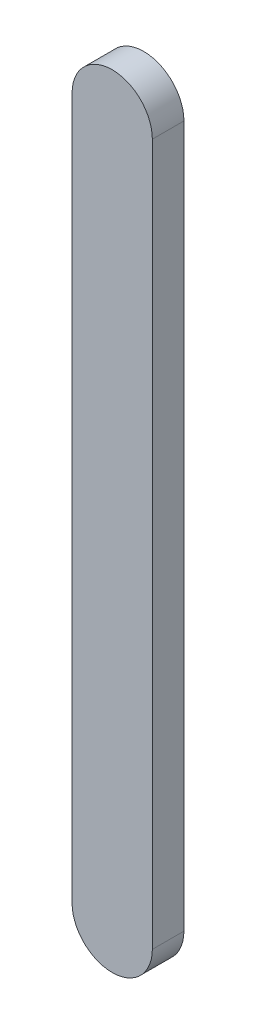
ISO-10303-21;
HEADER;
FILE_DESCRIPTION(('STEP AP214'),'2;1');
FILE_NAME('part.step','',(''),(''),'','','');
FILE_SCHEMA(('AUTOMOTIVE_DESIGN { 1 0 10303 214 1 1 1 1 }'));
ENDSEC;
DATA;
#1=APPLICATION_CONTEXT('core data for automotive mechanical design processes');
#2=APPLICATION_PROTOCOL_DEFINITION('international standard','automotive_design',2000,#1);
#3=PRODUCT_CONTEXT('',#1,'mechanical');
#4=PRODUCT('Part','Part','',(#3));
#5=PRODUCT_RELATED_PRODUCT_CATEGORY('part','',(#4));
#6=PRODUCT_DEFINITION_FORMATION('','',#4);
#7=PRODUCT_DEFINITION_CONTEXT('part definition',#1,'design');
#8=PRODUCT_DEFINITION('design','',#6,#7);
#9=PRODUCT_DEFINITION_SHAPE('','',#8);
#10=(LENGTH_UNIT() NAMED_UNIT(*) SI_UNIT(.MILLI.,.METRE.));
#11=(NAMED_UNIT(*) PLANE_ANGLE_UNIT() SI_UNIT($,.RADIAN.));
#12=(NAMED_UNIT(*) SI_UNIT($,.STERADIAN.) SOLID_ANGLE_UNIT());
#13=UNCERTAINTY_MEASURE_WITH_UNIT(LENGTH_MEASURE(1.E-05),#10,'distance_accuracy_value','');
#14=(GEOMETRIC_REPRESENTATION_CONTEXT(3) GLOBAL_UNCERTAINTY_ASSIGNED_CONTEXT((#13)) GLOBAL_UNIT_ASSIGNED_CONTEXT((#10,
#11,#12)) REPRESENTATION_CONTEXT('',''));
#15=CARTESIAN_POINT('',(0.,0.,0.));
#16=DIRECTION('',(0.,0.,1.));
#17=DIRECTION('',(1.,0.,0.));
#18=AXIS2_PLACEMENT_3D('',#15,#16,#17);
#19=CARTESIAN_POINT('',(111.76,73.914,0.));
#20=DIRECTION('',(-1.,0.,0.));
#21=DIRECTION('',(0.,1.,0.));
#22=AXIS2_PLACEMENT_3D('',#19,#20,#21);
#23=PLANE('',#22);
#24=DIRECTION('',(0.,1.,0.));
#25=VECTOR('',#24,1.);
#26=CARTESIAN_POINT('',(111.76,73.914,0.1999996));
#27=LINE('',#26,#25);
#28=CARTESIAN_POINT('',(111.76,73.914,0.1999996));
#29=VERTEX_POINT('',#28);
#30=CARTESIAN_POINT('',(111.76,78.3560028,0.1999996));
#31=VERTEX_POINT('',#30);
#32=EDGE_CURVE('E11',#29,#31,#27,.T.);
#33=ORIENTED_EDGE('',*,*,#32,.F.);
#34=DIRECTION('',(0.,0.,1.));
#35=VECTOR('',#34,1.);
#36=CARTESIAN_POINT('',(111.76,73.914,0.));
#37=LINE('',#36,#35);
#38=CARTESIAN_POINT('',(111.76,73.914,0.));
#39=VERTEX_POINT('',#38);
#40=EDGE_CURVE('E24',#39,#29,#37,.T.);
#41=ORIENTED_EDGE('',*,*,#40,.F.);
#42=DIRECTION('',(0.,1.,0.));
#43=VECTOR('',#42,1.);
#44=CARTESIAN_POINT('',(111.76,73.914,0.));
#45=LINE('',#44,#43);
#46=CARTESIAN_POINT('',(111.76,78.3560028,0.));
#47=VERTEX_POINT('',#46);
#48=EDGE_CURVE('E75',#39,#47,#45,.T.);
#49=ORIENTED_EDGE('',*,*,#48,.T.);
#50=DIRECTION('',(0.,0.,1.));
#51=VECTOR('',#50,1.);
#52=CARTESIAN_POINT('',(111.76,78.3560028,0.));
#53=LINE('',#52,#51);
#54=EDGE_CURVE('E37',#47,#31,#53,.T.);
#55=ORIENTED_EDGE('',*,*,#54,.T.);
#56=EDGE_LOOP('',(#33,#41,#49,#55));
#57=FACE_BOUND('',#56,.T.);
#58=ADVANCED_FACE('F17',(#57),#23,.F.);
#59=CARTESIAN_POINT('',(111.506,78.3560028,0.));
#60=DIRECTION('',(0.,0.,-1.));
#61=DIRECTION('',(1.,1.11896493820486E-13,0.));
#62=AXIS2_PLACEMENT_3D('',#59,#60,#61);
#63=CYLINDRICAL_SURFACE('',#62,0.25400000000001);
#64=CARTESIAN_POINT('',(111.506,78.3560028,0.1999996));
#65=DIRECTION('',(0.,0.,1.));
#66=DIRECTION('',(1.,1.11896493820486E-13,0.));
#67=AXIS2_PLACEMENT_3D('',#64,#65,#66);
#68=CIRCLE('',#67,0.25400000000001);
#69=CARTESIAN_POINT('',(111.252,78.3560028,0.1999996));
#70=VERTEX_POINT('',#69);
#71=EDGE_CURVE('E83',#31,#70,#68,.T.);
#72=ORIENTED_EDGE('',*,*,#71,.F.);
#73=ORIENTED_EDGE('',*,*,#54,.F.);
#74=CARTESIAN_POINT('',(111.506,78.3560028,0.));
#75=DIRECTION('',(0.,0.,1.));
#76=DIRECTION('',(1.,1.11896493820486E-13,0.));
#77=AXIS2_PLACEMENT_3D('',#74,#75,#76);
#78=CIRCLE('',#77,0.25400000000001);
#79=CARTESIAN_POINT('',(111.252,78.3560028,0.));
#80=VERTEX_POINT('',#79);
#81=EDGE_CURVE('E81',#47,#80,#78,.T.);
#82=ORIENTED_EDGE('',*,*,#81,.T.);
#83=DIRECTION('',(0.,0.,1.));
#84=VECTOR('',#83,1.);
#85=CARTESIAN_POINT('',(111.252,78.3560028,0.));
#86=LINE('',#85,#84);
#87=EDGE_CURVE('E67',#80,#70,#86,.T.);
#88=ORIENTED_EDGE('',*,*,#87,.T.);
#89=EDGE_LOOP('',(#72,#73,#82,#88));
#90=FACE_BOUND('',#89,.T.);
#91=ADVANCED_FACE('F89',(#90),#63,.T.);
#92=CARTESIAN_POINT('',(111.252,78.3560028,0.));
#93=DIRECTION('',(1.,0.,0.));
#94=DIRECTION('',(0.,-1.,0.));
#95=AXIS2_PLACEMENT_3D('',#92,#93,#94);
#96=PLANE('',#95);
#97=DIRECTION('',(0.,-1.,0.));
#98=VECTOR('',#97,1.);
#99=CARTESIAN_POINT('',(111.252,78.3560028,0.1999996));
#100=LINE('',#99,#98);
#101=CARTESIAN_POINT('',(111.252,73.914,0.1999996));
#102=VERTEX_POINT('',#101);
#103=EDGE_CURVE('E71',#70,#102,#100,.T.);
#104=ORIENTED_EDGE('',*,*,#103,.F.);
#105=ORIENTED_EDGE('',*,*,#87,.F.);
#106=DIRECTION('',(0.,-1.,0.));
#107=VECTOR('',#106,1.);
#108=CARTESIAN_POINT('',(111.252,78.3560028,0.));
#109=LINE('',#108,#107);
#110=CARTESIAN_POINT('',(111.252,73.914,0.));
#111=VERTEX_POINT('',#110);
#112=EDGE_CURVE('E63',#80,#111,#109,.T.);
#113=ORIENTED_EDGE('',*,*,#112,.T.);
#114=DIRECTION('',(0.,0.,1.));
#115=VECTOR('',#114,1.);
#116=CARTESIAN_POINT('',(111.252,73.914,0.));
#117=LINE('',#116,#115);
#118=EDGE_CURVE('E53',#111,#102,#117,.T.);
#119=ORIENTED_EDGE('',*,*,#118,.T.);
#120=EDGE_LOOP('',(#104,#105,#113,#119));
#121=FACE_BOUND('',#120,.T.);
#122=ADVANCED_FACE('F66',(#121),#96,.F.);
#123=CARTESIAN_POINT('',(111.506,73.914,0.));
#124=DIRECTION('',(0.,0.,-1.));
#125=DIRECTION('',(-1.,0.,0.));
#126=AXIS2_PLACEMENT_3D('',#123,#124,#125);
#127=CYLINDRICAL_SURFACE('',#126,0.25400000000001);
#128=CARTESIAN_POINT('',(111.506,73.914,0.1999996));
#129=DIRECTION('',(0.,0.,1.));
#130=DIRECTION('',(-1.,0.,0.));
#131=AXIS2_PLACEMENT_3D('',#128,#129,#130);
#132=CIRCLE('',#131,0.25400000000001);
#133=EDGE_CURVE('E59',#102,#29,#132,.T.);
#134=ORIENTED_EDGE('',*,*,#133,.F.);
#135=ORIENTED_EDGE('',*,*,#118,.F.);
#136=CARTESIAN_POINT('',(111.506,73.914,0.));
#137=DIRECTION('',(0.,0.,1.));
#138=DIRECTION('',(-1.,0.,0.));
#139=AXIS2_PLACEMENT_3D('',#136,#137,#138);
#140=CIRCLE('',#139,0.25400000000001);
#141=EDGE_CURVE('E57',#111,#39,#140,.T.);
#142=ORIENTED_EDGE('',*,*,#141,.T.);
#143=ORIENTED_EDGE('',*,*,#40,.T.);
#144=EDGE_LOOP('',(#134,#135,#142,#143));
#145=FACE_BOUND('',#144,.T.);
#146=ADVANCED_FACE('F55',(#145),#127,.T.);
#147=CARTESIAN_POINT('',(111.76,73.914,0.));
#148=DIRECTION('',(0.,0.,-1.));
#149=DIRECTION('',(-1.,0.,0.));
#150=AXIS2_PLACEMENT_3D('',#147,#148,#149);
#151=PLANE('',#150);
#152=ORIENTED_EDGE('',*,*,#141,.F.);
#153=ORIENTED_EDGE('',*,*,#112,.F.);
#154=ORIENTED_EDGE('',*,*,#81,.F.);
#155=ORIENTED_EDGE('',*,*,#48,.F.);
#156=EDGE_LOOP('',(#152,#153,#154,#155));
#157=FACE_BOUND('',#156,.T.);
#158=ADVANCED_FACE('F74',(#157),#151,.T.);
#159=CARTESIAN_POINT('',(111.76,73.914,0.1999996));
#160=DIRECTION('',(0.,0.,-1.));
#161=DIRECTION('',(-1.,0.,0.));
#162=AXIS2_PLACEMENT_3D('',#159,#160,#161);
#163=PLANE('',#162);
#164=ORIENTED_EDGE('',*,*,#32,.T.);
#165=ORIENTED_EDGE('',*,*,#71,.T.);
#166=ORIENTED_EDGE('',*,*,#103,.T.);
#167=ORIENTED_EDGE('',*,*,#133,.T.);
#168=EDGE_LOOP('',(#164,#165,#166,#167));
#169=FACE_BOUND('',#168,.T.);
#170=ADVANCED_FACE('F91',(#169),#163,.F.);
#171=CLOSED_SHELL('',(#58,#91,#122,#146,#158,#170));
#172=MANIFOLD_SOLID_BREP('B1',#171);
#173=ADVANCED_BREP_SHAPE_REPRESENTATION('',(#18,#172),#14);
#174=SHAPE_DEFINITION_REPRESENTATION(#9,#173);
ENDSEC;
END-ISO-10303-21;
